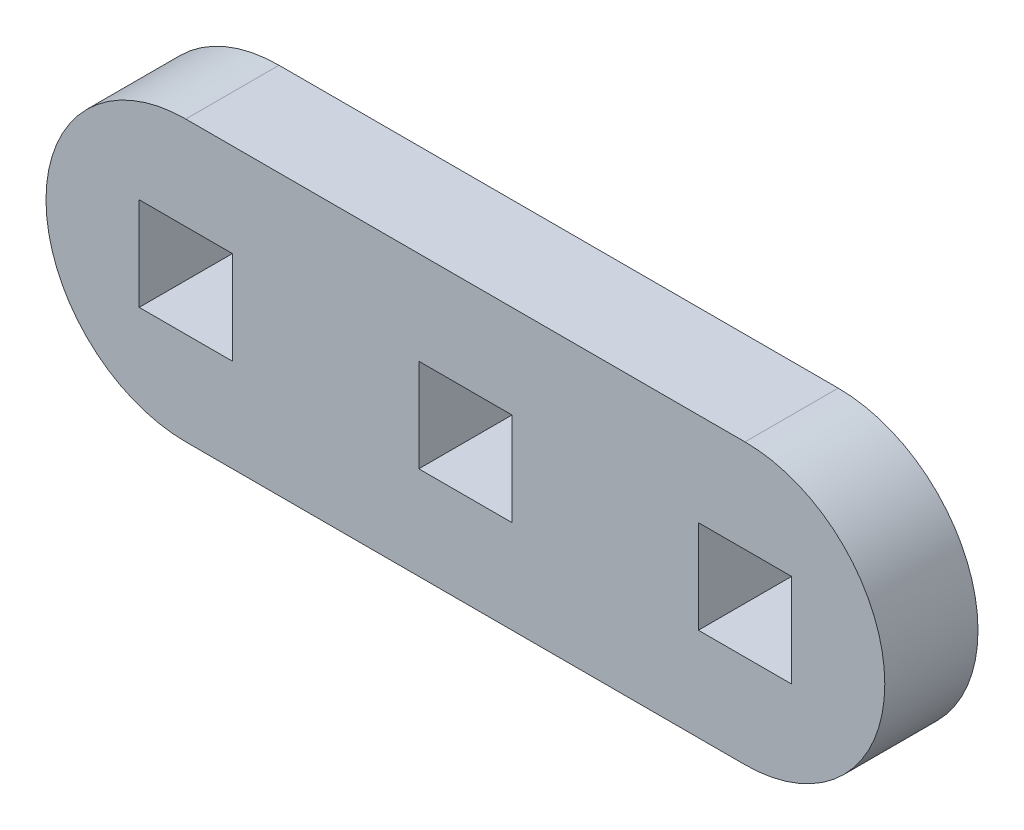
ISO-10303-21;
HEADER;
FILE_DESCRIPTION(('STEP AP214'),'2;1');
FILE_NAME('part.step','',(''),(''),'','','');
FILE_SCHEMA(('AUTOMOTIVE_DESIGN { 1 0 10303 214 1 1 1 1 }'));
ENDSEC;
DATA;
#1=APPLICATION_CONTEXT('core data for automotive mechanical design processes');
#2=APPLICATION_PROTOCOL_DEFINITION('international standard','automotive_design',2000,#1);
#3=PRODUCT_CONTEXT('',#1,'mechanical');
#4=PRODUCT('Part','Part','',(#3));
#5=PRODUCT_RELATED_PRODUCT_CATEGORY('part','',(#4));
#6=PRODUCT_DEFINITION_FORMATION('','',#4);
#7=PRODUCT_DEFINITION_CONTEXT('part definition',#1,'design');
#8=PRODUCT_DEFINITION('design','',#6,#7);
#9=PRODUCT_DEFINITION_SHAPE('','',#8);
#10=(LENGTH_UNIT() NAMED_UNIT(*) SI_UNIT(.MILLI.,.METRE.));
#11=(NAMED_UNIT(*) PLANE_ANGLE_UNIT() SI_UNIT($,.RADIAN.));
#12=(NAMED_UNIT(*) SI_UNIT($,.STERADIAN.) SOLID_ANGLE_UNIT());
#13=UNCERTAINTY_MEASURE_WITH_UNIT(LENGTH_MEASURE(1.E-05),#10,'distance_accuracy_value','');
#14=(GEOMETRIC_REPRESENTATION_CONTEXT(3) GLOBAL_UNCERTAINTY_ASSIGNED_CONTEXT((#13)) GLOBAL_UNIT_ASSIGNED_CONTEXT((#10,
#11,#12)) REPRESENTATION_CONTEXT('',''));
#15=CARTESIAN_POINT('',(0.,0.,0.));
#16=DIRECTION('',(0.,0.,1.));
#17=DIRECTION('',(1.,0.,0.));
#18=AXIS2_PLACEMENT_3D('',#15,#16,#17);
#19=CARTESIAN_POINT('',(12.4373802408,295.045342772,3.));
#20=DIRECTION('',(0.,0.,1.));
#21=DIRECTION('',(1.,0.,0.));
#22=AXIS2_PLACEMENT_3D('',#19,#20,#21);
#23=PLANE('',#22);
#24=DIRECTION('',(0.,-1.,0.));
#25=VECTOR('',#24,1.);
#26=CARTESIAN_POINT('',(19.9373802408,296.545342772,3.));
#27=LINE('',#26,#25);
#28=CARTESIAN_POINT('',(19.9373802408,296.545342772,3.));
#29=VERTEX_POINT('',#28);
#30=CARTESIAN_POINT('',(19.9373802408,293.545342772,3.));
#31=VERTEX_POINT('',#30);
#32=EDGE_CURVE('E184',#29,#31,#27,.T.);
#33=ORIENTED_EDGE('',*,*,#32,.F.);
#34=DIRECTION('',(-1.,0.,0.));
#35=VECTOR('',#34,1.);
#36=CARTESIAN_POINT('',(22.9373802408,296.545342772,3.));
#37=LINE('',#36,#35);
#38=CARTESIAN_POINT('',(22.9373802408,296.545342772,3.));
#39=VERTEX_POINT('',#38);
#40=EDGE_CURVE('E182',#39,#29,#37,.T.);
#41=ORIENTED_EDGE('',*,*,#40,.F.);
#42=DIRECTION('',(0.,1.,0.));
#43=VECTOR('',#42,1.);
#44=CARTESIAN_POINT('',(22.9373802408,293.545342772,3.));
#45=LINE('',#44,#43);
#46=CARTESIAN_POINT('',(22.9373802408,293.545342772,3.));
#47=VERTEX_POINT('',#46);
#48=EDGE_CURVE('E190',#47,#39,#45,.T.);
#49=ORIENTED_EDGE('',*,*,#48,.F.);
#50=DIRECTION('',(1.,0.,0.));
#51=VECTOR('',#50,1.);
#52=CARTESIAN_POINT('',(19.9373802408,293.545342772,3.));
#53=LINE('',#52,#51);
#54=EDGE_CURVE('E187',#31,#47,#53,.T.);
#55=ORIENTED_EDGE('',*,*,#54,.F.);
#56=EDGE_LOOP('',(#33,#41,#49,#55));
#57=FACE_BOUND('',#56,.T.);
#58=CARTESIAN_POINT('',(12.4373802408,295.045342772,3.));
#59=DIRECTION('',(0.,0.,1.));
#60=DIRECTION('',(1.,0.,0.));
#61=AXIS2_PLACEMENT_3D('',#58,#59,#60);
#62=CIRCLE('',#61,4.49999999999998);
#63=CARTESIAN_POINT('',(12.4373802408,299.545342772,3.));
#64=VERTEX_POINT('',#63);
#65=CARTESIAN_POINT('',(12.4373802408,290.545342772,3.));
#66=VERTEX_POINT('',#65);
#67=EDGE_CURVE('E244',#64,#66,#62,.T.);
#68=ORIENTED_EDGE('',*,*,#67,.T.);
#69=DIRECTION('',(1.,0.,0.));
#70=VECTOR('',#69,1.);
#71=CARTESIAN_POINT('',(12.4373802408,290.545342772,3.));
#72=LINE('',#71,#70);
#73=CARTESIAN_POINT('',(30.4373802408,290.545342772,3.));
#74=VERTEX_POINT('',#73);
#75=EDGE_CURVE('E247',#66,#74,#72,.T.);
#76=ORIENTED_EDGE('',*,*,#75,.T.);
#77=CARTESIAN_POINT('',(30.4373802408,295.045342772,3.));
#78=DIRECTION('',(0.,0.,1.));
#79=DIRECTION('',(1.,0.,0.));
#80=AXIS2_PLACEMENT_3D('',#77,#78,#79);
#81=CIRCLE('',#80,4.49999999999998);
#82=CARTESIAN_POINT('',(30.4373802408,299.545342772,3.));
#83=VERTEX_POINT('',#82);
#84=EDGE_CURVE('E250',#74,#83,#81,.T.);
#85=ORIENTED_EDGE('',*,*,#84,.T.);
#86=DIRECTION('',(-1.,0.,0.));
#87=VECTOR('',#86,1.);
#88=CARTESIAN_POINT('',(12.4373802408,299.545342772,3.));
#89=LINE('',#88,#87);
#90=EDGE_CURVE('E252',#83,#64,#89,.T.);
#91=ORIENTED_EDGE('',*,*,#90,.T.);
#92=EDGE_LOOP('',(#68,#76,#85,#91));
#93=FACE_BOUND('',#92,.T.);
#94=DIRECTION('',(0.,-1.,0.));
#95=VECTOR('',#94,1.);
#96=CARTESIAN_POINT('',(10.9373802408,296.545342772,3.));
#97=LINE('',#96,#95);
#98=CARTESIAN_POINT('',(10.9373802408,296.545342772,3.));
#99=VERTEX_POINT('',#98);
#100=CARTESIAN_POINT('',(10.9373802408,293.545342772,3.));
#101=VERTEX_POINT('',#100);
#102=EDGE_CURVE('E215',#99,#101,#97,.T.);
#103=ORIENTED_EDGE('',*,*,#102,.F.);
#104=DIRECTION('',(-1.,0.,0.));
#105=VECTOR('',#104,1.);
#106=CARTESIAN_POINT('',(13.9373802408,296.545342772,3.));
#107=LINE('',#106,#105);
#108=CARTESIAN_POINT('',(13.9373802408,296.545342772,3.));
#109=VERTEX_POINT('',#108);
#110=EDGE_CURVE('E213',#109,#99,#107,.T.);
#111=ORIENTED_EDGE('',*,*,#110,.F.);
#112=DIRECTION('',(0.,1.,0.));
#113=VECTOR('',#112,1.);
#114=CARTESIAN_POINT('',(13.9373802408,293.545342772,3.));
#115=LINE('',#114,#113);
#116=CARTESIAN_POINT('',(13.9373802408,293.545342772,3.));
#117=VERTEX_POINT('',#116);
#118=EDGE_CURVE('E221',#117,#109,#115,.T.);
#119=ORIENTED_EDGE('',*,*,#118,.F.);
#120=DIRECTION('',(1.,0.,0.));
#121=VECTOR('',#120,1.);
#122=CARTESIAN_POINT('',(10.9373802408,293.545342772,3.));
#123=LINE('',#122,#121);
#124=EDGE_CURVE('E218',#101,#117,#123,.T.);
#125=ORIENTED_EDGE('',*,*,#124,.F.);
#126=EDGE_LOOP('',(#103,#111,#119,#125));
#127=FACE_BOUND('',#126,.T.);
#128=DIRECTION('',(0.,-1.,0.));
#129=VECTOR('',#128,1.);
#130=CARTESIAN_POINT('',(28.9373802408,296.545342772,3.));
#131=LINE('',#130,#129);
#132=CARTESIAN_POINT('',(28.9373802408,296.545342772,3.));
#133=VERTEX_POINT('',#132);
#134=CARTESIAN_POINT('',(28.9373802408,293.545342772,3.));
#135=VERTEX_POINT('',#134);
#136=EDGE_CURVE('E154',#133,#135,#131,.T.);
#137=ORIENTED_EDGE('',*,*,#136,.F.);
#138=DIRECTION('',(-1.,0.,0.));
#139=VECTOR('',#138,1.);
#140=CARTESIAN_POINT('',(31.9373802408,296.545342772,3.));
#141=LINE('',#140,#139);
#142=CARTESIAN_POINT('',(31.9373802408,296.545342772,3.));
#143=VERTEX_POINT('',#142);
#144=EDGE_CURVE('E146',#143,#133,#141,.T.);
#145=ORIENTED_EDGE('',*,*,#144,.F.);
#146=DIRECTION('',(0.,1.,0.));
#147=VECTOR('',#146,1.);
#148=CARTESIAN_POINT('',(31.9373802408,293.545342772,3.));
#149=LINE('',#148,#147);
#150=CARTESIAN_POINT('',(31.9373802408,293.545342772,3.));
#151=VERTEX_POINT('',#150);
#152=EDGE_CURVE('E168',#151,#143,#149,.T.);
#153=ORIENTED_EDGE('',*,*,#152,.F.);
#154=DIRECTION('',(1.,0.,0.));
#155=VECTOR('',#154,1.);
#156=CARTESIAN_POINT('',(28.9373802408,293.545342772,3.));
#157=LINE('',#156,#155);
#158=EDGE_CURVE('E166',#135,#151,#157,.T.);
#159=ORIENTED_EDGE('',*,*,#158,.F.);
#160=EDGE_LOOP('',(#137,#145,#153,#159));
#161=FACE_BOUND('',#160,.T.);
#162=ADVANCED_FACE('F33',(#57,#93,#127,#161),#23,.T.);
#163=CARTESIAN_POINT('',(12.4373802408,295.045342772,0.));
#164=DIRECTION('',(0.,0.,1.));
#165=DIRECTION('',(1.,0.,0.));
#166=AXIS2_PLACEMENT_3D('',#163,#164,#165);
#167=PLANE('',#166);
#168=DIRECTION('',(-1.,0.,0.));
#169=VECTOR('',#168,1.);
#170=CARTESIAN_POINT('',(22.9373802408,296.545342772,0.));
#171=LINE('',#170,#169);
#172=CARTESIAN_POINT('',(22.9373802408,296.545342772,0.));
#173=VERTEX_POINT('',#172);
#174=CARTESIAN_POINT('',(19.9373802408,296.545342772,0.));
#175=VERTEX_POINT('',#174);
#176=EDGE_CURVE('E162',#173,#175,#171,.T.);
#177=ORIENTED_EDGE('',*,*,#176,.T.);
#178=DIRECTION('',(0.,-1.,0.));
#179=VECTOR('',#178,1.);
#180=CARTESIAN_POINT('',(19.9373802408,296.545342772,0.));
#181=LINE('',#180,#179);
#182=CARTESIAN_POINT('',(19.9373802408,293.545342772,0.));
#183=VERTEX_POINT('',#182);
#184=EDGE_CURVE('E195',#175,#183,#181,.T.);
#185=ORIENTED_EDGE('',*,*,#184,.T.);
#186=DIRECTION('',(1.,0.,0.));
#187=VECTOR('',#186,1.);
#188=CARTESIAN_POINT('',(19.9373802408,293.545342772,0.));
#189=LINE('',#188,#187);
#190=CARTESIAN_POINT('',(22.9373802408,293.545342772,0.));
#191=VERTEX_POINT('',#190);
#192=EDGE_CURVE('E198',#183,#191,#189,.T.);
#193=ORIENTED_EDGE('',*,*,#192,.T.);
#194=DIRECTION('',(0.,1.,0.));
#195=VECTOR('',#194,1.);
#196=CARTESIAN_POINT('',(22.9373802408,293.545342772,0.));
#197=LINE('',#196,#195);
#198=EDGE_CURVE('E185',#191,#173,#197,.T.);
#199=ORIENTED_EDGE('',*,*,#198,.T.);
#200=EDGE_LOOP('',(#177,#185,#193,#199));
#201=FACE_BOUND('',#200,.T.);
#202=CARTESIAN_POINT('',(12.4373802408,295.045342772,0.));
#203=DIRECTION('',(0.,0.,1.));
#204=DIRECTION('',(1.,0.,0.));
#205=AXIS2_PLACEMENT_3D('',#202,#203,#204);
#206=CIRCLE('',#205,4.49999999999998);
#207=CARTESIAN_POINT('',(12.4373802408,299.545342772,0.));
#208=VERTEX_POINT('',#207);
#209=CARTESIAN_POINT('',(12.4373802408,290.545342772,0.));
#210=VERTEX_POINT('',#209);
#211=EDGE_CURVE('E243',#208,#210,#206,.T.);
#212=ORIENTED_EDGE('',*,*,#211,.F.);
#213=DIRECTION('',(-1.,0.,0.));
#214=VECTOR('',#213,1.);
#215=CARTESIAN_POINT('',(12.4373802408,299.545342772,0.));
#216=LINE('',#215,#214);
#217=CARTESIAN_POINT('',(30.4373802408,299.545342772,0.));
#218=VERTEX_POINT('',#217);
#219=EDGE_CURVE('E248',#218,#208,#216,.T.);
#220=ORIENTED_EDGE('',*,*,#219,.F.);
#221=CARTESIAN_POINT('',(30.4373802408,295.045342772,0.));
#222=DIRECTION('',(0.,0.,1.));
#223=DIRECTION('',(1.,0.,0.));
#224=AXIS2_PLACEMENT_3D('',#221,#222,#223);
#225=CIRCLE('',#224,4.49999999999998);
#226=CARTESIAN_POINT('',(30.4373802408,290.545342772,0.));
#227=VERTEX_POINT('',#226);
#228=EDGE_CURVE('E259',#227,#218,#225,.T.);
#229=ORIENTED_EDGE('',*,*,#228,.F.);
#230=DIRECTION('',(1.,0.,0.));
#231=VECTOR('',#230,1.);
#232=CARTESIAN_POINT('',(12.4373802408,290.545342772,0.));
#233=LINE('',#232,#231);
#234=EDGE_CURVE('E257',#210,#227,#233,.T.);
#235=ORIENTED_EDGE('',*,*,#234,.F.);
#236=EDGE_LOOP('',(#212,#220,#229,#235));
#237=FACE_BOUND('',#236,.T.);
#238=DIRECTION('',(-1.,0.,0.));
#239=VECTOR('',#238,1.);
#240=CARTESIAN_POINT('',(13.9373802408,296.545342772,0.));
#241=LINE('',#240,#239);
#242=CARTESIAN_POINT('',(13.9373802408,296.545342772,0.));
#243=VERTEX_POINT('',#242);
#244=CARTESIAN_POINT('',(10.9373802408,296.545342772,0.));
#245=VERTEX_POINT('',#244);
#246=EDGE_CURVE('E212',#243,#245,#241,.T.);
#247=ORIENTED_EDGE('',*,*,#246,.T.);
#248=DIRECTION('',(0.,-1.,0.));
#249=VECTOR('',#248,1.);
#250=CARTESIAN_POINT('',(10.9373802408,296.545342772,0.));
#251=LINE('',#250,#249);
#252=CARTESIAN_POINT('',(10.9373802408,293.545342772,0.));
#253=VERTEX_POINT('',#252);
#254=EDGE_CURVE('E226',#245,#253,#251,.T.);
#255=ORIENTED_EDGE('',*,*,#254,.T.);
#256=DIRECTION('',(1.,0.,0.));
#257=VECTOR('',#256,1.);
#258=CARTESIAN_POINT('',(10.9373802408,293.545342772,0.));
#259=LINE('',#258,#257);
#260=CARTESIAN_POINT('',(13.9373802408,293.545342772,0.));
#261=VERTEX_POINT('',#260);
#262=EDGE_CURVE('E229',#253,#261,#259,.T.);
#263=ORIENTED_EDGE('',*,*,#262,.T.);
#264=DIRECTION('',(0.,1.,0.));
#265=VECTOR('',#264,1.);
#266=CARTESIAN_POINT('',(13.9373802408,293.545342772,0.));
#267=LINE('',#266,#265);
#268=EDGE_CURVE('E216',#261,#243,#267,.T.);
#269=ORIENTED_EDGE('',*,*,#268,.T.);
#270=EDGE_LOOP('',(#247,#255,#263,#269));
#271=FACE_BOUND('',#270,.T.);
#272=DIRECTION('',(-1.,0.,0.));
#273=VECTOR('',#272,1.);
#274=CARTESIAN_POINT('',(31.9373802408,296.545342772,0.));
#275=LINE('',#274,#273);
#276=CARTESIAN_POINT('',(31.9373802408,296.545342772,0.));
#277=VERTEX_POINT('',#276);
#278=CARTESIAN_POINT('',(28.9373802408,296.545342772,0.));
#279=VERTEX_POINT('',#278);
#280=EDGE_CURVE('E56',#277,#279,#275,.T.);
#281=ORIENTED_EDGE('',*,*,#280,.T.);
#282=DIRECTION('',(0.,-1.,0.));
#283=VECTOR('',#282,1.);
#284=CARTESIAN_POINT('',(28.9373802408,296.545342772,0.));
#285=LINE('',#284,#283);
#286=CARTESIAN_POINT('',(28.9373802408,293.545342772,0.));
#287=VERTEX_POINT('',#286);
#288=EDGE_CURVE('E161',#279,#287,#285,.T.);
#289=ORIENTED_EDGE('',*,*,#288,.T.);
#290=DIRECTION('',(1.,0.,0.));
#291=VECTOR('',#290,1.);
#292=CARTESIAN_POINT('',(28.9373802408,293.545342772,0.));
#293=LINE('',#292,#291);
#294=CARTESIAN_POINT('',(31.9373802408,293.545342772,0.));
#295=VERTEX_POINT('',#294);
#296=EDGE_CURVE('E174',#287,#295,#293,.T.);
#297=ORIENTED_EDGE('',*,*,#296,.T.);
#298=DIRECTION('',(0.,1.,0.));
#299=VECTOR('',#298,1.);
#300=CARTESIAN_POINT('',(31.9373802408,293.545342772,0.));
#301=LINE('',#300,#299);
#302=EDGE_CURVE('E155',#295,#277,#301,.T.);
#303=ORIENTED_EDGE('',*,*,#302,.T.);
#304=EDGE_LOOP('',(#281,#289,#297,#303));
#305=FACE_BOUND('',#304,.T.);
#306=ADVANCED_FACE('F277',(#201,#237,#271,#305),#167,.F.);
#307=CARTESIAN_POINT('',(12.4373802408,295.045342772,3.));
#308=DIRECTION('',(0.,0.,-1.));
#309=DIRECTION('',(-1.,0.,0.));
#310=AXIS2_PLACEMENT_3D('',#307,#308,#309);
#311=CYLINDRICAL_SURFACE('',#310,4.49999999999998);
#312=ORIENTED_EDGE('',*,*,#211,.T.);
#313=DIRECTION('',(0.,0.,-1.));
#314=VECTOR('',#313,1.);
#315=CARTESIAN_POINT('',(12.4373802408,290.545342772,3.));
#316=LINE('',#315,#314);
#317=EDGE_CURVE('E11',#66,#210,#316,.T.);
#318=ORIENTED_EDGE('',*,*,#317,.F.);
#319=ORIENTED_EDGE('',*,*,#67,.F.);
#320=DIRECTION('',(0.,0.,-1.));
#321=VECTOR('',#320,1.);
#322=CARTESIAN_POINT('',(12.4373802408,299.545342772,3.));
#323=LINE('',#322,#321);
#324=EDGE_CURVE('E254',#64,#208,#323,.T.);
#325=ORIENTED_EDGE('',*,*,#324,.T.);
#326=EDGE_LOOP('',(#312,#318,#319,#325));
#327=FACE_BOUND('',#326,.T.);
#328=ADVANCED_FACE('F35',(#327),#311,.T.);
#329=CARTESIAN_POINT('',(12.4373802408,290.545342772,3.));
#330=DIRECTION('',(0.,1.,0.));
#331=DIRECTION('',(0.,0.,1.));
#332=AXIS2_PLACEMENT_3D('',#329,#330,#331);
#333=PLANE('',#332);
#334=ORIENTED_EDGE('',*,*,#234,.T.);
#335=DIRECTION('',(0.,0.,-1.));
#336=VECTOR('',#335,1.);
#337=CARTESIAN_POINT('',(30.4373802408,290.545342772,3.));
#338=LINE('',#337,#336);
#339=EDGE_CURVE('E41',#74,#227,#338,.T.);
#340=ORIENTED_EDGE('',*,*,#339,.F.);
#341=ORIENTED_EDGE('',*,*,#75,.F.);
#342=ORIENTED_EDGE('',*,*,#317,.T.);
#343=EDGE_LOOP('',(#334,#340,#341,#342));
#344=FACE_BOUND('',#343,.T.);
#345=ADVANCED_FACE('F288',(#344),#333,.F.);
#346=CARTESIAN_POINT('',(30.4373802408,295.045342772,3.));
#347=DIRECTION('',(0.,0.,-1.));
#348=DIRECTION('',(-1.,0.,0.));
#349=AXIS2_PLACEMENT_3D('',#346,#347,#348);
#350=CYLINDRICAL_SURFACE('',#349,4.49999999999998);
#351=ORIENTED_EDGE('',*,*,#228,.T.);
#352=DIRECTION('',(0.,0.,-1.));
#353=VECTOR('',#352,1.);
#354=CARTESIAN_POINT('',(30.4373802408,299.545342772,3.));
#355=LINE('',#354,#353);
#356=EDGE_CURVE('E264',#83,#218,#355,.T.);
#357=ORIENTED_EDGE('',*,*,#356,.F.);
#358=ORIENTED_EDGE('',*,*,#84,.F.);
#359=ORIENTED_EDGE('',*,*,#339,.T.);
#360=EDGE_LOOP('',(#351,#357,#358,#359));
#361=FACE_BOUND('',#360,.T.);
#362=ADVANCED_FACE('F271',(#361),#350,.T.);
#363=CARTESIAN_POINT('',(12.4373802408,299.545342772,3.));
#364=DIRECTION('',(0.,-1.,0.));
#365=DIRECTION('',(0.,0.,-1.));
#366=AXIS2_PLACEMENT_3D('',#363,#364,#365);
#367=PLANE('',#366);
#368=ORIENTED_EDGE('',*,*,#219,.T.);
#369=ORIENTED_EDGE('',*,*,#324,.F.);
#370=ORIENTED_EDGE('',*,*,#90,.F.);
#371=ORIENTED_EDGE('',*,*,#356,.T.);
#372=EDGE_LOOP('',(#368,#369,#370,#371));
#373=FACE_BOUND('',#372,.T.);
#374=ADVANCED_FACE('F281',(#373),#367,.F.);
#375=CARTESIAN_POINT('',(13.9373802408,296.545342772,3.));
#376=DIRECTION('',(0.,-1.,0.));
#377=DIRECTION('',(0.,0.,-1.));
#378=AXIS2_PLACEMENT_3D('',#375,#376,#377);
#379=PLANE('',#378);
#380=ORIENTED_EDGE('',*,*,#246,.F.);
#381=DIRECTION('',(0.,0.,-1.));
#382=VECTOR('',#381,1.);
#383=CARTESIAN_POINT('',(13.9373802408,296.545342772,3.));
#384=LINE('',#383,#382);
#385=EDGE_CURVE('E223',#109,#243,#384,.T.);
#386=ORIENTED_EDGE('',*,*,#385,.F.);
#387=ORIENTED_EDGE('',*,*,#110,.T.);
#388=DIRECTION('',(0.,0.,-1.));
#389=VECTOR('',#388,1.);
#390=CARTESIAN_POINT('',(10.9373802408,296.545342772,3.));
#391=LINE('',#390,#389);
#392=EDGE_CURVE('E240',#99,#245,#391,.T.);
#393=ORIENTED_EDGE('',*,*,#392,.T.);
#394=EDGE_LOOP('',(#380,#386,#387,#393));
#395=FACE_BOUND('',#394,.T.);
#396=ADVANCED_FACE('F305',(#395),#379,.T.);
#397=CARTESIAN_POINT('',(10.9373802408,296.545342772,3.));
#398=DIRECTION('',(1.,0.,0.));
#399=DIRECTION('',(0.,0.,-1.));
#400=AXIS2_PLACEMENT_3D('',#397,#398,#399);
#401=PLANE('',#400);
#402=ORIENTED_EDGE('',*,*,#254,.F.);
#403=ORIENTED_EDGE('',*,*,#392,.F.);
#404=ORIENTED_EDGE('',*,*,#102,.T.);
#405=DIRECTION('',(0.,0.,-1.));
#406=VECTOR('',#405,1.);
#407=CARTESIAN_POINT('',(10.9373802408,293.545342772,3.));
#408=LINE('',#407,#406);
#409=EDGE_CURVE('E238',#101,#253,#408,.T.);
#410=ORIENTED_EDGE('',*,*,#409,.T.);
#411=EDGE_LOOP('',(#402,#403,#404,#410));
#412=FACE_BOUND('',#411,.T.);
#413=ADVANCED_FACE('F312',(#412),#401,.T.);
#414=CARTESIAN_POINT('',(10.9373802408,293.545342772,3.));
#415=DIRECTION('',(0.,1.,0.));
#416=DIRECTION('',(0.,0.,1.));
#417=AXIS2_PLACEMENT_3D('',#414,#415,#416);
#418=PLANE('',#417);
#419=ORIENTED_EDGE('',*,*,#262,.F.);
#420=ORIENTED_EDGE('',*,*,#409,.F.);
#421=ORIENTED_EDGE('',*,*,#124,.T.);
#422=DIRECTION('',(0.,0.,-1.));
#423=VECTOR('',#422,1.);
#424=CARTESIAN_POINT('',(13.9373802408,293.545342772,3.));
#425=LINE('',#424,#423);
#426=EDGE_CURVE('E236',#117,#261,#425,.T.);
#427=ORIENTED_EDGE('',*,*,#426,.T.);
#428=EDGE_LOOP('',(#419,#420,#421,#427));
#429=FACE_BOUND('',#428,.T.);
#430=ADVANCED_FACE('F317',(#429),#418,.T.);
#431=CARTESIAN_POINT('',(13.9373802408,293.545342772,3.));
#432=DIRECTION('',(-1.,0.,0.));
#433=DIRECTION('',(0.,0.,1.));
#434=AXIS2_PLACEMENT_3D('',#431,#432,#433);
#435=PLANE('',#434);
#436=ORIENTED_EDGE('',*,*,#268,.F.);
#437=ORIENTED_EDGE('',*,*,#426,.F.);
#438=ORIENTED_EDGE('',*,*,#118,.T.);
#439=ORIENTED_EDGE('',*,*,#385,.T.);
#440=EDGE_LOOP('',(#436,#437,#438,#439));
#441=FACE_BOUND('',#440,.T.);
#442=ADVANCED_FACE('F324',(#441),#435,.T.);
#443=CARTESIAN_POINT('',(22.9373802408,296.545342772,3.));
#444=DIRECTION('',(0.,-1.,0.));
#445=DIRECTION('',(0.,0.,-1.));
#446=AXIS2_PLACEMENT_3D('',#443,#444,#445);
#447=PLANE('',#446);
#448=ORIENTED_EDGE('',*,*,#176,.F.);
#449=DIRECTION('',(0.,0.,-1.));
#450=VECTOR('',#449,1.);
#451=CARTESIAN_POINT('',(22.9373802408,296.545342772,3.));
#452=LINE('',#451,#450);
#453=EDGE_CURVE('E192',#39,#173,#452,.T.);
#454=ORIENTED_EDGE('',*,*,#453,.F.);
#455=ORIENTED_EDGE('',*,*,#40,.T.);
#456=DIRECTION('',(0.,0.,-1.));
#457=VECTOR('',#456,1.);
#458=CARTESIAN_POINT('',(19.9373802408,296.545342772,3.));
#459=LINE('',#458,#457);
#460=EDGE_CURVE('E209',#29,#175,#459,.T.);
#461=ORIENTED_EDGE('',*,*,#460,.T.);
#462=EDGE_LOOP('',(#448,#454,#455,#461));
#463=FACE_BOUND('',#462,.T.);
#464=ADVANCED_FACE('F337',(#463),#447,.T.);
#465=CARTESIAN_POINT('',(19.9373802408,296.545342772,3.));
#466=DIRECTION('',(1.,0.,0.));
#467=DIRECTION('',(0.,0.,-1.));
#468=AXIS2_PLACEMENT_3D('',#465,#466,#467);
#469=PLANE('',#468);
#470=ORIENTED_EDGE('',*,*,#184,.F.);
#471=ORIENTED_EDGE('',*,*,#460,.F.);
#472=ORIENTED_EDGE('',*,*,#32,.T.);
#473=DIRECTION('',(0.,0.,-1.));
#474=VECTOR('',#473,1.);
#475=CARTESIAN_POINT('',(19.9373802408,293.545342772,3.));
#476=LINE('',#475,#474);
#477=EDGE_CURVE('E207',#31,#183,#476,.T.);
#478=ORIENTED_EDGE('',*,*,#477,.T.);
#479=EDGE_LOOP('',(#470,#471,#472,#478));
#480=FACE_BOUND('',#479,.T.);
#481=ADVANCED_FACE('F342',(#480),#469,.T.);
#482=CARTESIAN_POINT('',(19.9373802408,293.545342772,3.));
#483=DIRECTION('',(0.,1.,0.));
#484=DIRECTION('',(0.,0.,1.));
#485=AXIS2_PLACEMENT_3D('',#482,#483,#484);
#486=PLANE('',#485);
#487=ORIENTED_EDGE('',*,*,#192,.F.);
#488=ORIENTED_EDGE('',*,*,#477,.F.);
#489=ORIENTED_EDGE('',*,*,#54,.T.);
#490=DIRECTION('',(0.,0.,-1.));
#491=VECTOR('',#490,1.);
#492=CARTESIAN_POINT('',(22.9373802408,293.545342772,3.));
#493=LINE('',#492,#491);
#494=EDGE_CURVE('E205',#47,#191,#493,.T.);
#495=ORIENTED_EDGE('',*,*,#494,.T.);
#496=EDGE_LOOP('',(#487,#488,#489,#495));
#497=FACE_BOUND('',#496,.T.);
#498=ADVANCED_FACE('F346',(#497),#486,.T.);
#499=CARTESIAN_POINT('',(22.9373802408,293.545342772,3.));
#500=DIRECTION('',(-1.,0.,0.));
#501=DIRECTION('',(0.,0.,1.));
#502=AXIS2_PLACEMENT_3D('',#499,#500,#501);
#503=PLANE('',#502);
#504=ORIENTED_EDGE('',*,*,#198,.F.);
#505=ORIENTED_EDGE('',*,*,#494,.F.);
#506=ORIENTED_EDGE('',*,*,#48,.T.);
#507=ORIENTED_EDGE('',*,*,#453,.T.);
#508=EDGE_LOOP('',(#504,#505,#506,#507));
#509=FACE_BOUND('',#508,.T.);
#510=ADVANCED_FACE('F350',(#509),#503,.T.);
#511=CARTESIAN_POINT('',(31.9373802408,296.545342772,3.));
#512=DIRECTION('',(0.,-1.,0.));
#513=DIRECTION('',(0.,0.,-1.));
#514=AXIS2_PLACEMENT_3D('',#511,#512,#513);
#515=PLANE('',#514);
#516=ORIENTED_EDGE('',*,*,#280,.F.);
#517=DIRECTION('',(0.,0.,-1.));
#518=VECTOR('',#517,1.);
#519=CARTESIAN_POINT('',(31.9373802408,296.545342772,3.));
#520=LINE('',#519,#518);
#521=EDGE_CURVE('E150',#143,#277,#520,.T.);
#522=ORIENTED_EDGE('',*,*,#521,.F.);
#523=ORIENTED_EDGE('',*,*,#144,.T.);
#524=DIRECTION('',(0.,0.,-1.));
#525=VECTOR('',#524,1.);
#526=CARTESIAN_POINT('',(28.9373802408,296.545342772,3.));
#527=LINE('',#526,#525);
#528=EDGE_CURVE('E149',#133,#279,#527,.T.);
#529=ORIENTED_EDGE('',*,*,#528,.T.);
#530=EDGE_LOOP('',(#516,#522,#523,#529));
#531=FACE_BOUND('',#530,.T.);
#532=ADVANCED_FACE('F148',(#531),#515,.T.);
#533=CARTESIAN_POINT('',(28.9373802408,296.545342772,3.));
#534=DIRECTION('',(1.,0.,0.));
#535=DIRECTION('',(0.,0.,-1.));
#536=AXIS2_PLACEMENT_3D('',#533,#534,#535);
#537=PLANE('',#536);
#538=ORIENTED_EDGE('',*,*,#288,.F.);
#539=ORIENTED_EDGE('',*,*,#528,.F.);
#540=ORIENTED_EDGE('',*,*,#136,.T.);
#541=DIRECTION('',(0.,0.,-1.));
#542=VECTOR('',#541,1.);
#543=CARTESIAN_POINT('',(28.9373802408,293.545342772,3.));
#544=LINE('',#543,#542);
#545=EDGE_CURVE('E163',#135,#287,#544,.T.);
#546=ORIENTED_EDGE('',*,*,#545,.T.);
#547=EDGE_LOOP('',(#538,#539,#540,#546));
#548=FACE_BOUND('',#547,.T.);
#549=ADVANCED_FACE('F158',(#548),#537,.T.);
#550=CARTESIAN_POINT('',(28.9373802408,293.545342772,3.));
#551=DIRECTION('',(0.,1.,0.));
#552=DIRECTION('',(0.,0.,1.));
#553=AXIS2_PLACEMENT_3D('',#550,#551,#552);
#554=PLANE('',#553);
#555=ORIENTED_EDGE('',*,*,#296,.F.);
#556=ORIENTED_EDGE('',*,*,#545,.F.);
#557=ORIENTED_EDGE('',*,*,#158,.T.);
#558=DIRECTION('',(0.,0.,-1.));
#559=VECTOR('',#558,1.);
#560=CARTESIAN_POINT('',(31.9373802408,293.545342772,3.));
#561=LINE('',#560,#559);
#562=EDGE_CURVE('E48',#151,#295,#561,.T.);
#563=ORIENTED_EDGE('',*,*,#562,.T.);
#564=EDGE_LOOP('',(#555,#556,#557,#563));
#565=FACE_BOUND('',#564,.T.);
#566=ADVANCED_FACE('F359',(#565),#554,.T.);
#567=CARTESIAN_POINT('',(31.9373802408,293.545342772,3.));
#568=DIRECTION('',(-1.,0.,0.));
#569=DIRECTION('',(0.,0.,1.));
#570=AXIS2_PLACEMENT_3D('',#567,#568,#569);
#571=PLANE('',#570);
#572=ORIENTED_EDGE('',*,*,#302,.F.);
#573=ORIENTED_EDGE('',*,*,#562,.F.);
#574=ORIENTED_EDGE('',*,*,#152,.T.);
#575=ORIENTED_EDGE('',*,*,#521,.T.);
#576=EDGE_LOOP('',(#572,#573,#574,#575));
#577=FACE_BOUND('',#576,.T.);
#578=ADVANCED_FACE('F362',(#577),#571,.T.);
#579=CLOSED_SHELL('',(#162,#306,#328,#345,#362,#374,#396,#413,#430,#442,#464,#481,#498,#510,
#532,#549,#566,#578));
#580=MANIFOLD_SOLID_BREP('B2',#579);
#581=ADVANCED_BREP_SHAPE_REPRESENTATION('',(#18,#580),#14);
#582=SHAPE_DEFINITION_REPRESENTATION(#9,#581);
ENDSEC;
END-ISO-10303-21;
